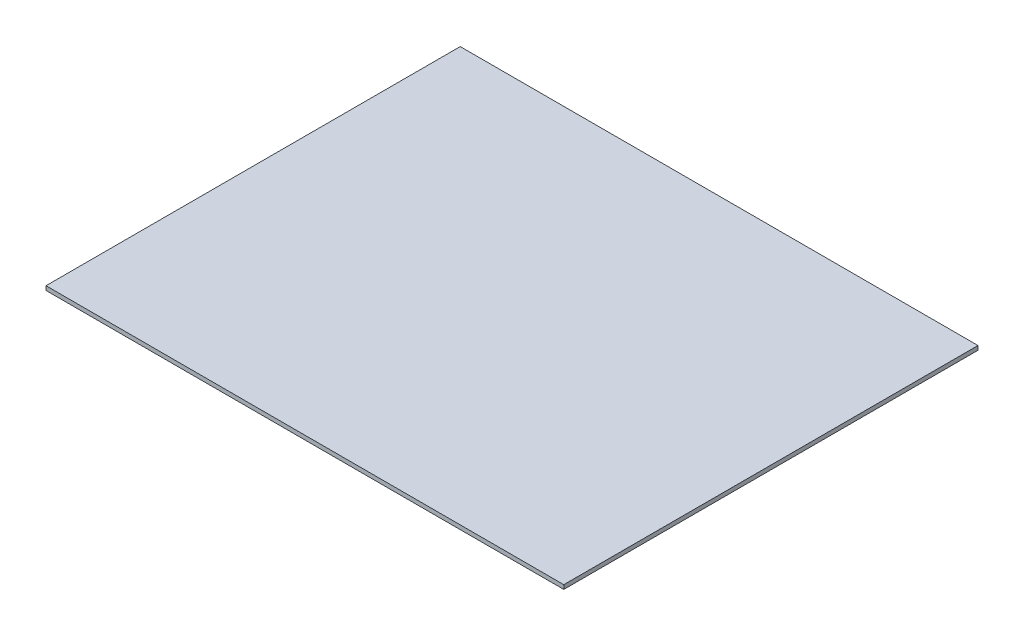
ISO-10303-21;
HEADER;
FILE_DESCRIPTION(('STEP AP214'),'2;1');
FILE_NAME('part.step','',(''),(''),'','','');
FILE_SCHEMA(('AUTOMOTIVE_DESIGN { 1 0 10303 214 1 1 1 1 }'));
ENDSEC;
DATA;
#1=APPLICATION_CONTEXT('core data for automotive mechanical design processes');
#2=APPLICATION_PROTOCOL_DEFINITION('international standard','automotive_design',2000,#1);
#3=PRODUCT_CONTEXT('',#1,'mechanical');
#4=PRODUCT('Part','Part','',(#3));
#5=PRODUCT_RELATED_PRODUCT_CATEGORY('part','',(#4));
#6=PRODUCT_DEFINITION_FORMATION('','',#4);
#7=PRODUCT_DEFINITION_CONTEXT('part definition',#1,'design');
#8=PRODUCT_DEFINITION('design','',#6,#7);
#9=PRODUCT_DEFINITION_SHAPE('','',#8);
#10=(LENGTH_UNIT() NAMED_UNIT(*) SI_UNIT(.MILLI.,.METRE.));
#11=(NAMED_UNIT(*) PLANE_ANGLE_UNIT() SI_UNIT($,.RADIAN.));
#12=(NAMED_UNIT(*) SI_UNIT($,.STERADIAN.) SOLID_ANGLE_UNIT());
#13=UNCERTAINTY_MEASURE_WITH_UNIT(LENGTH_MEASURE(1.E-05),#10,'distance_accuracy_value','');
#14=(GEOMETRIC_REPRESENTATION_CONTEXT(3) GLOBAL_UNCERTAINTY_ASSIGNED_CONTEXT((#13)) GLOBAL_UNIT_ASSIGNED_CONTEXT((#10,
#11,#12)) REPRESENTATION_CONTEXT('',''));
#15=CARTESIAN_POINT('',(0.,0.,0.));
#16=DIRECTION('',(0.,0.,1.));
#17=DIRECTION('',(1.,0.,0.));
#18=AXIS2_PLACEMENT_3D('',#15,#16,#17);
#19=CARTESIAN_POINT('',(127.,2.032,101.6));
#20=DIRECTION('',(-1.,0.,0.));
#21=DIRECTION('',(0.,0.,1.));
#22=AXIS2_PLACEMENT_3D('',#19,#20,#21);
#23=PLANE('',#22);
#24=DIRECTION('',(0.,0.,-1.));
#25=VECTOR('',#24,1.);
#26=CARTESIAN_POINT('',(127.,0.,101.6));
#27=LINE('',#26,#25);
#28=CARTESIAN_POINT('',(127.,0.,101.6));
#29=VERTEX_POINT('',#28);
#30=CARTESIAN_POINT('',(127.,0.,-101.6));
#31=VERTEX_POINT('',#30);
#32=EDGE_CURVE('E96',#29,#31,#27,.T.);
#33=ORIENTED_EDGE('',*,*,#32,.T.);
#34=DIRECTION('',(0.,-1.,0.));
#35=VECTOR('',#34,1.);
#36=CARTESIAN_POINT('',(127.,2.032,-101.6));
#37=LINE('',#36,#35);
#38=CARTESIAN_POINT('',(127.,2.032,-101.6));
#39=VERTEX_POINT('',#38);
#40=EDGE_CURVE('E11',#39,#31,#37,.T.);
#41=ORIENTED_EDGE('',*,*,#40,.F.);
#42=DIRECTION('',(0.,0.,-1.));
#43=VECTOR('',#42,1.);
#44=CARTESIAN_POINT('',(127.,2.032,101.6));
#45=LINE('',#44,#43);
#46=CARTESIAN_POINT('',(127.,2.032,101.6));
#47=VERTEX_POINT('',#46);
#48=EDGE_CURVE('E84',#47,#39,#45,.T.);
#49=ORIENTED_EDGE('',*,*,#48,.F.);
#50=DIRECTION('',(0.,-1.,0.));
#51=VECTOR('',#50,1.);
#52=CARTESIAN_POINT('',(127.,2.032,101.6));
#53=LINE('',#52,#51);
#54=EDGE_CURVE('E92',#47,#29,#53,.T.);
#55=ORIENTED_EDGE('',*,*,#54,.T.);
#56=EDGE_LOOP('',(#33,#41,#49,#55));
#57=FACE_BOUND('',#56,.T.);
#58=ADVANCED_FACE('F33',(#57),#23,.F.);
#59=CARTESIAN_POINT('',(-127.,2.032,-101.6));
#60=DIRECTION('',(0.,0.,1.));
#61=DIRECTION('',(1.,0.,0.));
#62=AXIS2_PLACEMENT_3D('',#59,#60,#61);
#63=PLANE('',#62);
#64=DIRECTION('',(-1.,0.,0.));
#65=VECTOR('',#64,1.);
#66=CARTESIAN_POINT('',(-127.,0.,-101.6));
#67=LINE('',#66,#65);
#68=CARTESIAN_POINT('',(-127.,0.,-101.6));
#69=VERTEX_POINT('',#68);
#70=EDGE_CURVE('E88',#31,#69,#67,.T.);
#71=ORIENTED_EDGE('',*,*,#70,.T.);
#72=DIRECTION('',(0.,-1.,0.));
#73=VECTOR('',#72,1.);
#74=CARTESIAN_POINT('',(-127.,2.032,-101.6));
#75=LINE('',#74,#73);
#76=CARTESIAN_POINT('',(-127.,2.032,-101.6));
#77=VERTEX_POINT('',#76);
#78=EDGE_CURVE('E41',#77,#69,#75,.T.);
#79=ORIENTED_EDGE('',*,*,#78,.F.);
#80=DIRECTION('',(-1.,0.,0.));
#81=VECTOR('',#80,1.);
#82=CARTESIAN_POINT('',(-127.,2.032,-101.6));
#83=LINE('',#82,#81);
#84=EDGE_CURVE('E79',#39,#77,#83,.T.);
#85=ORIENTED_EDGE('',*,*,#84,.F.);
#86=ORIENTED_EDGE('',*,*,#40,.T.);
#87=EDGE_LOOP('',(#71,#79,#85,#86));
#88=FACE_BOUND('',#87,.T.);
#89=ADVANCED_FACE('F87',(#88),#63,.F.);
#90=CARTESIAN_POINT('',(-127.,2.032,101.6));
#91=DIRECTION('',(1.,0.,0.));
#92=DIRECTION('',(0.,0.,-1.));
#93=AXIS2_PLACEMENT_3D('',#90,#91,#92);
#94=PLANE('',#93);
#95=DIRECTION('',(0.,0.,1.));
#96=VECTOR('',#95,1.);
#97=CARTESIAN_POINT('',(-127.,0.,101.6));
#98=LINE('',#97,#96);
#99=CARTESIAN_POINT('',(-127.,0.,101.6));
#100=VERTEX_POINT('',#99);
#101=EDGE_CURVE('E66',#69,#100,#98,.T.);
#102=ORIENTED_EDGE('',*,*,#101,.T.);
#103=DIRECTION('',(0.,-1.,0.));
#104=VECTOR('',#103,1.);
#105=CARTESIAN_POINT('',(-127.,2.032,101.6));
#106=LINE('',#105,#104);
#107=CARTESIAN_POINT('',(-127.,2.032,101.6));
#108=VERTEX_POINT('',#107);
#109=EDGE_CURVE('E89',#108,#100,#106,.T.);
#110=ORIENTED_EDGE('',*,*,#109,.F.);
#111=DIRECTION('',(0.,0.,1.));
#112=VECTOR('',#111,1.);
#113=CARTESIAN_POINT('',(-127.,2.032,101.6));
#114=LINE('',#113,#112);
#115=EDGE_CURVE('E82',#77,#108,#114,.T.);
#116=ORIENTED_EDGE('',*,*,#115,.F.);
#117=ORIENTED_EDGE('',*,*,#78,.T.);
#118=EDGE_LOOP('',(#102,#110,#116,#117));
#119=FACE_BOUND('',#118,.T.);
#120=ADVANCED_FACE('F90',(#119),#94,.F.);
#121=CARTESIAN_POINT('',(-127.,2.032,101.6));
#122=DIRECTION('',(0.,0.,-1.));
#123=DIRECTION('',(-1.,0.,0.));
#124=AXIS2_PLACEMENT_3D('',#121,#122,#123);
#125=PLANE('',#124);
#126=DIRECTION('',(1.,0.,0.));
#127=VECTOR('',#126,1.);
#128=CARTESIAN_POINT('',(-127.,0.,101.6));
#129=LINE('',#128,#127);
#130=EDGE_CURVE('E72',#100,#29,#129,.T.);
#131=ORIENTED_EDGE('',*,*,#130,.T.);
#132=ORIENTED_EDGE('',*,*,#54,.F.);
#133=DIRECTION('',(1.,0.,0.));
#134=VECTOR('',#133,1.);
#135=CARTESIAN_POINT('',(-127.,2.032,101.6));
#136=LINE('',#135,#134);
#137=EDGE_CURVE('E49',#108,#47,#136,.T.);
#138=ORIENTED_EDGE('',*,*,#137,.F.);
#139=ORIENTED_EDGE('',*,*,#109,.T.);
#140=EDGE_LOOP('',(#131,#132,#138,#139));
#141=FACE_BOUND('',#140,.T.);
#142=ADVANCED_FACE('F103',(#141),#125,.F.);
#143=CARTESIAN_POINT('',(0.,2.032,0.));
#144=DIRECTION('',(0.,-1.,0.));
#145=DIRECTION('',(0.,0.,-1.));
#146=AXIS2_PLACEMENT_3D('',#143,#144,#145);
#147=PLANE('',#146);
#148=ORIENTED_EDGE('',*,*,#48,.T.);
#149=ORIENTED_EDGE('',*,*,#84,.T.);
#150=ORIENTED_EDGE('',*,*,#115,.T.);
#151=ORIENTED_EDGE('',*,*,#137,.T.);
#152=EDGE_LOOP('',(#148,#149,#150,#151));
#153=FACE_BOUND('',#152,.T.);
#154=ADVANCED_FACE('F80',(#153),#147,.F.);
#155=CARTESIAN_POINT('',(0.,0.,0.));
#156=DIRECTION('',(0.,-1.,0.));
#157=DIRECTION('',(0.,0.,-1.));
#158=AXIS2_PLACEMENT_3D('',#155,#156,#157);
#159=PLANE('',#158);
#160=ORIENTED_EDGE('',*,*,#32,.F.);
#161=ORIENTED_EDGE('',*,*,#130,.F.);
#162=ORIENTED_EDGE('',*,*,#101,.F.);
#163=ORIENTED_EDGE('',*,*,#70,.F.);
#164=EDGE_LOOP('',(#160,#161,#162,#163));
#165=FACE_BOUND('',#164,.T.);
#166=ADVANCED_FACE('F106',(#165),#159,.T.);
#167=CLOSED_SHELL('',(#58,#89,#120,#142,#154,#166));
#168=MANIFOLD_SOLID_BREP('B2',#167);
#169=ADVANCED_BREP_SHAPE_REPRESENTATION('',(#18,#168),#14);
#170=SHAPE_DEFINITION_REPRESENTATION(#9,#169);
ENDSEC;
END-ISO-10303-21;
